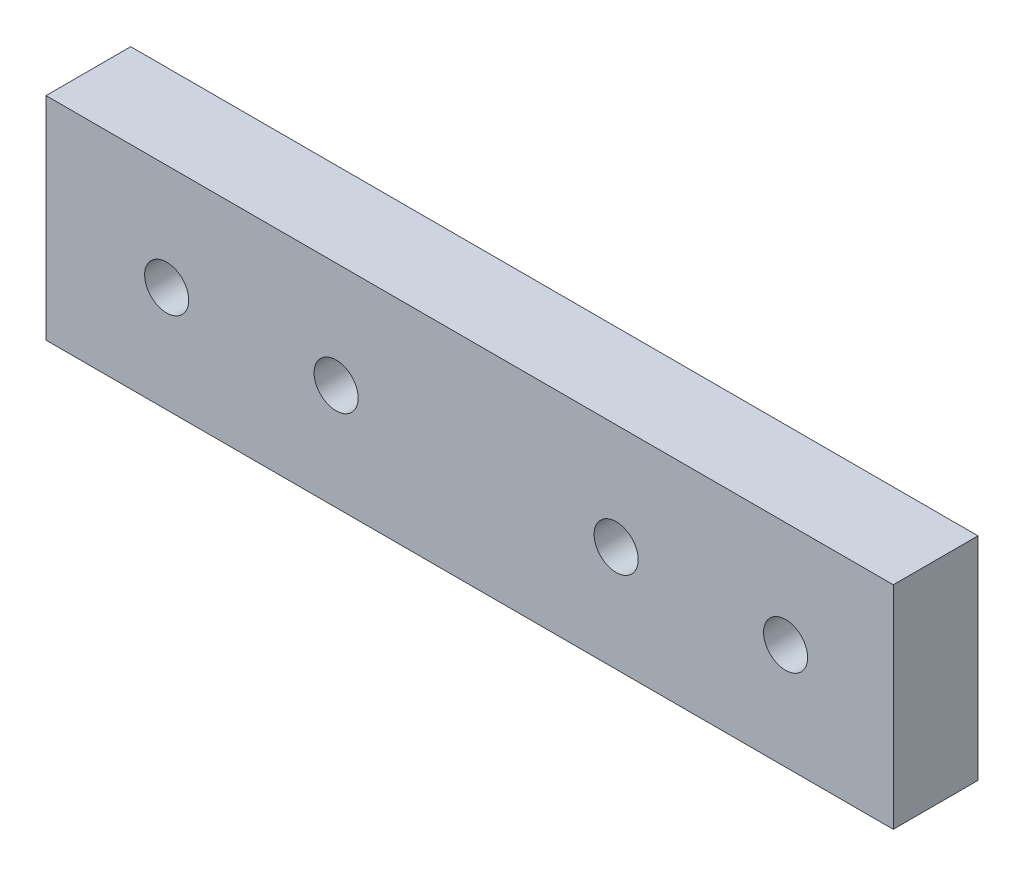
ISO-10303-21;
HEADER;
FILE_DESCRIPTION(('STEP AP214'),'2;1');
FILE_NAME('part.step','',(''),(''),'','','');
FILE_SCHEMA(('AUTOMOTIVE_DESIGN { 1 0 10303 214 1 1 1 1 }'));
ENDSEC;
DATA;
#1=APPLICATION_CONTEXT('core data for automotive mechanical design processes');
#2=APPLICATION_PROTOCOL_DEFINITION('international standard','automotive_design',2000,#1);
#3=PRODUCT_CONTEXT('',#1,'mechanical');
#4=PRODUCT('Part','Part','',(#3));
#5=PRODUCT_RELATED_PRODUCT_CATEGORY('part','',(#4));
#6=PRODUCT_DEFINITION_FORMATION('','',#4);
#7=PRODUCT_DEFINITION_CONTEXT('part definition',#1,'design');
#8=PRODUCT_DEFINITION('design','',#6,#7);
#9=PRODUCT_DEFINITION_SHAPE('','',#8);
#10=(LENGTH_UNIT() NAMED_UNIT(*) SI_UNIT(.MILLI.,.METRE.));
#11=(NAMED_UNIT(*) PLANE_ANGLE_UNIT() SI_UNIT($,.RADIAN.));
#12=(NAMED_UNIT(*) SI_UNIT($,.STERADIAN.) SOLID_ANGLE_UNIT());
#13=UNCERTAINTY_MEASURE_WITH_UNIT(LENGTH_MEASURE(1.E-05),#10,'distance_accuracy_value','');
#14=(GEOMETRIC_REPRESENTATION_CONTEXT(3) GLOBAL_UNCERTAINTY_ASSIGNED_CONTEXT((#13)) GLOBAL_UNIT_ASSIGNED_CONTEXT((#10,
#11,#12)) REPRESENTATION_CONTEXT('',''));
#15=CARTESIAN_POINT('',(0.,0.,0.));
#16=DIRECTION('',(0.,0.,1.));
#17=DIRECTION('',(1.,0.,0.));
#18=AXIS2_PLACEMENT_3D('',#15,#16,#17);
#19=CARTESIAN_POINT('',(116.291637204089,12.5,-75.));
#20=DIRECTION('',(0.,0.,1.));
#21=DIRECTION('',(1.,0.,0.));
#22=AXIS2_PLACEMENT_3D('',#19,#20,#21);
#23=CYLINDRICAL_SURFACE('',#22,2.6);
#24=CARTESIAN_POINT('',(116.291637204089,12.5,-17.5000000000001));
#25=DIRECTION('',(0.,0.,-1.));
#26=DIRECTION('',(-1.,0.,0.));
#27=AXIS2_PLACEMENT_3D('',#24,#25,#26);
#28=CIRCLE('',#27,2.6);
#29=CARTESIAN_POINT('',(113.691637204089,12.5,-17.5000000000001));
#30=VERTEX_POINT('',#29);
#31=EDGE_CURVE('E444',#30,#30,#28,.T.);
#32=ORIENTED_EDGE('',*,*,#31,.F.);
#33=EDGE_LOOP('',(#32));
#34=FACE_BOUND('',#33,.T.);
#35=CARTESIAN_POINT('',(116.291637204089,12.5,-24.5000000000001));
#36=DIRECTION('',(0.,0.,-1.));
#37=DIRECTION('',(0.,1.,0.));
#38=AXIS2_PLACEMENT_3D('',#35,#36,#37);
#39=CIRCLE('',#38,2.6);
#40=CARTESIAN_POINT('',(116.291637204089,15.1,-24.5000000000001));
#41=VERTEX_POINT('',#40);
#42=EDGE_CURVE('E36',#41,#41,#39,.F.);
#43=ORIENTED_EDGE('',*,*,#42,.F.);
#44=EDGE_LOOP('',(#43));
#45=FACE_BOUND('',#44,.T.);
#46=ADVANCED_FACE('F32',(#34,#45),#23,.F.);
#47=CARTESIAN_POINT('',(43.2405642550662,12.5,-75.));
#48=DIRECTION('',(0.,0.,1.));
#49=DIRECTION('',(1.,0.,0.));
#50=AXIS2_PLACEMENT_3D('',#47,#48,#49);
#51=CYLINDRICAL_SURFACE('',#50,2.6);
#52=CARTESIAN_POINT('',(43.2405642550662,12.5,-17.5000000000001));
#53=DIRECTION('',(0.,0.,-1.));
#54=DIRECTION('',(-1.,0.,0.));
#55=AXIS2_PLACEMENT_3D('',#52,#53,#54);
#56=CIRCLE('',#55,2.6);
#57=CARTESIAN_POINT('',(40.6405642550662,12.5,-17.5000000000001));
#58=VERTEX_POINT('',#57);
#59=EDGE_CURVE('E447',#58,#58,#56,.T.);
#60=ORIENTED_EDGE('',*,*,#59,.F.);
#61=EDGE_LOOP('',(#60));
#62=FACE_BOUND('',#61,.T.);
#63=CARTESIAN_POINT('',(43.2405642550662,12.5,-24.5000000000001));
#64=DIRECTION('',(0.,0.,-1.));
#65=DIRECTION('',(-1.,0.,0.));
#66=AXIS2_PLACEMENT_3D('',#63,#64,#65);
#67=CIRCLE('',#66,2.6);
#68=CARTESIAN_POINT('',(40.6405642550662,12.5,-24.5000000000001));
#69=VERTEX_POINT('',#68);
#70=EDGE_CURVE('E459',#69,#69,#67,.F.);
#71=ORIENTED_EDGE('',*,*,#70,.F.);
#72=EDGE_LOOP('',(#71));
#73=FACE_BOUND('',#72,.T.);
#74=ADVANCED_FACE('F469',(#62,#73),#51,.F.);
#75=CARTESIAN_POINT('',(96.2916372040886,12.5,-75.));
#76=DIRECTION('',(0.,0.,1.));
#77=DIRECTION('',(1.,0.,0.));
#78=AXIS2_PLACEMENT_3D('',#75,#76,#77);
#79=CYLINDRICAL_SURFACE('',#78,2.6);
#80=CARTESIAN_POINT('',(96.2916372040886,12.5,-17.5000000000001));
#81=DIRECTION('',(0.,0.,-1.));
#82=DIRECTION('',(-1.,0.,0.));
#83=AXIS2_PLACEMENT_3D('',#80,#81,#82);
#84=CIRCLE('',#83,2.6);
#85=CARTESIAN_POINT('',(93.6916372040886,12.5,-17.5000000000001));
#86=VERTEX_POINT('',#85);
#87=EDGE_CURVE('E450',#86,#86,#84,.T.);
#88=ORIENTED_EDGE('',*,*,#87,.F.);
#89=EDGE_LOOP('',(#88));
#90=FACE_BOUND('',#89,.T.);
#91=CARTESIAN_POINT('',(96.2916372040886,12.5,-24.5000000000001));
#92=DIRECTION('',(0.,0.,-1.));
#93=DIRECTION('',(-1.,0.,0.));
#94=AXIS2_PLACEMENT_3D('',#91,#92,#93);
#95=CIRCLE('',#94,2.6);
#96=CARTESIAN_POINT('',(93.6916372040886,12.5,-24.5000000000001));
#97=VERTEX_POINT('',#96);
#98=EDGE_CURVE('E457',#97,#97,#95,.F.);
#99=ORIENTED_EDGE('',*,*,#98,.F.);
#100=EDGE_LOOP('',(#99));
#101=FACE_BOUND('',#100,.T.);
#102=ADVANCED_FACE('F475',(#90,#101),#79,.F.);
#103=CARTESIAN_POINT('',(63.2405642550662,12.5,-75.));
#104=DIRECTION('',(0.,0.,1.));
#105=DIRECTION('',(1.,0.,0.));
#106=AXIS2_PLACEMENT_3D('',#103,#104,#105);
#107=CYLINDRICAL_SURFACE('',#106,2.6);
#108=CARTESIAN_POINT('',(63.2405642550662,12.5,-17.5000000000001));
#109=DIRECTION('',(0.,0.,-1.));
#110=DIRECTION('',(-1.,0.,0.));
#111=AXIS2_PLACEMENT_3D('',#108,#109,#110);
#112=CIRCLE('',#111,2.6);
#113=CARTESIAN_POINT('',(60.6405642550662,12.5,-17.5000000000001));
#114=VERTEX_POINT('',#113);
#115=EDGE_CURVE('E432',#114,#114,#112,.T.);
#116=ORIENTED_EDGE('',*,*,#115,.F.);
#117=EDGE_LOOP('',(#116));
#118=FACE_BOUND('',#117,.T.);
#119=CARTESIAN_POINT('',(63.2405642550662,12.5,-24.5000000000001));
#120=DIRECTION('',(0.,0.,-1.));
#121=DIRECTION('',(-1.,0.,0.));
#122=AXIS2_PLACEMENT_3D('',#119,#120,#121);
#123=CIRCLE('',#122,2.6);
#124=CARTESIAN_POINT('',(60.6405642550662,12.5,-24.5000000000001));
#125=VERTEX_POINT('',#124);
#126=EDGE_CURVE('E268',#125,#125,#123,.F.);
#127=ORIENTED_EDGE('',*,*,#126,.F.);
#128=EDGE_LOOP('',(#127));
#129=FACE_BOUND('',#128,.T.);
#130=ADVANCED_FACE('F502',(#118,#129),#107,.F.);
#131=CARTESIAN_POINT('',(29.0000000000001,25.,-27.5000000000001));
#132=DIRECTION('',(1.,0.,0.));
#133=DIRECTION('',(0.,0.,-1.));
#134=AXIS2_PLACEMENT_3D('',#131,#132,#133);
#135=PLANE('',#134);
#136=DIRECTION('',(0.,1.,0.));
#137=VECTOR('',#136,1.);
#138=CARTESIAN_POINT('',(29.0000000000001,25.,-17.5000000000001));
#139=LINE('',#138,#137);
#140=CARTESIAN_POINT('',(29.0000000000001,0.,-17.5000000000001));
#141=VERTEX_POINT('',#140);
#142=CARTESIAN_POINT('',(29.0000000000001,25.,-17.5000000000001));
#143=VERTEX_POINT('',#142);
#144=EDGE_CURVE('E428',#141,#143,#139,.T.);
#145=ORIENTED_EDGE('',*,*,#144,.T.);
#146=DIRECTION('',(0.,0.,1.));
#147=VECTOR('',#146,1.);
#148=CARTESIAN_POINT('',(29.0000000000001,25.,-27.5000000000001));
#149=LINE('',#148,#147);
#150=CARTESIAN_POINT('',(29.0000000000001,25.,-27.5000000000001));
#151=VERTEX_POINT('',#150);
#152=EDGE_CURVE('E11',#151,#143,#149,.T.);
#153=ORIENTED_EDGE('',*,*,#152,.F.);
#154=DIRECTION('',(0.,1.,0.));
#155=VECTOR('',#154,1.);
#156=CARTESIAN_POINT('',(29.0000000000001,25.,-27.5000000000001));
#157=LINE('',#156,#155);
#158=CARTESIAN_POINT('',(29.0000000000001,0.,-27.5000000000001));
#159=VERTEX_POINT('',#158);
#160=EDGE_CURVE('E417',#159,#151,#157,.T.);
#161=ORIENTED_EDGE('',*,*,#160,.F.);
#162=DIRECTION('',(0.,0.,1.));
#163=VECTOR('',#162,1.);
#164=CARTESIAN_POINT('',(29.0000000000001,0.,-27.5000000000001));
#165=LINE('',#164,#163);
#166=EDGE_CURVE('E427',#159,#141,#165,.T.);
#167=ORIENTED_EDGE('',*,*,#166,.T.);
#168=EDGE_LOOP('',(#145,#153,#161,#167));
#169=FACE_BOUND('',#168,.T.);
#170=ADVANCED_FACE('F34',(#169),#135,.F.);
#171=CARTESIAN_POINT('',(129.,25.,-27.5000000000001));
#172=DIRECTION('',(0.,-1.,0.));
#173=DIRECTION('',(0.,0.,-1.));
#174=AXIS2_PLACEMENT_3D('',#171,#172,#173);
#175=PLANE('',#174);
#176=DIRECTION('',(1.,0.,0.));
#177=VECTOR('',#176,1.);
#178=CARTESIAN_POINT('',(129.,25.,-17.5000000000001));
#179=LINE('',#178,#177);
#180=CARTESIAN_POINT('',(129.,25.,-17.5000000000001));
#181=VERTEX_POINT('',#180);
#182=EDGE_CURVE('E431',#143,#181,#179,.T.);
#183=ORIENTED_EDGE('',*,*,#182,.T.);
#184=DIRECTION('',(0.,0.,1.));
#185=VECTOR('',#184,1.);
#186=CARTESIAN_POINT('',(129.,25.,-27.5000000000001));
#187=LINE('',#186,#185);
#188=CARTESIAN_POINT('',(129.,25.,-27.5000000000001));
#189=VERTEX_POINT('',#188);
#190=EDGE_CURVE('E41',#189,#181,#187,.T.);
#191=ORIENTED_EDGE('',*,*,#190,.F.);
#192=DIRECTION('',(1.,0.,0.));
#193=VECTOR('',#192,1.);
#194=CARTESIAN_POINT('',(129.,25.,-27.5000000000001));
#195=LINE('',#194,#193);
#196=EDGE_CURVE('E420',#151,#189,#195,.T.);
#197=ORIENTED_EDGE('',*,*,#196,.F.);
#198=ORIENTED_EDGE('',*,*,#152,.T.);
#199=EDGE_LOOP('',(#183,#191,#197,#198));
#200=FACE_BOUND('',#199,.T.);
#201=ADVANCED_FACE('F495',(#200),#175,.F.);
#202=CARTESIAN_POINT('',(129.,25.,-27.5000000000001));
#203=DIRECTION('',(-1.,0.,0.));
#204=DIRECTION('',(0.,-1.,0.));
#205=AXIS2_PLACEMENT_3D('',#202,#203,#204);
#206=PLANE('',#205);
#207=DIRECTION('',(0.,-1.,0.));
#208=VECTOR('',#207,1.);
#209=CARTESIAN_POINT('',(129.,25.,-17.5000000000001));
#210=LINE('',#209,#208);
#211=CARTESIAN_POINT('',(129.,0.,-17.5000000000001));
#212=VERTEX_POINT('',#211);
#213=EDGE_CURVE('E434',#181,#212,#210,.T.);
#214=ORIENTED_EDGE('',*,*,#213,.T.);
#215=DIRECTION('',(0.,0.,1.));
#216=VECTOR('',#215,1.);
#217=CARTESIAN_POINT('',(129.,0.,-27.5000000000001));
#218=LINE('',#217,#216);
#219=CARTESIAN_POINT('',(129.,0.,-27.5000000000001));
#220=VERTEX_POINT('',#219);
#221=EDGE_CURVE('E439',#220,#212,#218,.T.);
#222=ORIENTED_EDGE('',*,*,#221,.F.);
#223=DIRECTION('',(0.,-1.,0.));
#224=VECTOR('',#223,1.);
#225=CARTESIAN_POINT('',(129.,25.,-27.5000000000001));
#226=LINE('',#225,#224);
#227=EDGE_CURVE('E423',#189,#220,#226,.T.);
#228=ORIENTED_EDGE('',*,*,#227,.F.);
#229=ORIENTED_EDGE('',*,*,#190,.T.);
#230=EDGE_LOOP('',(#214,#222,#228,#229));
#231=FACE_BOUND('',#230,.T.);
#232=ADVANCED_FACE('F492',(#231),#206,.F.);
#233=CARTESIAN_POINT('',(129.,0.,-27.5000000000001));
#234=DIRECTION('',(0.,1.,0.));
#235=DIRECTION('',(-1.,0.,0.));
#236=AXIS2_PLACEMENT_3D('',#233,#234,#235);
#237=PLANE('',#236);
#238=DIRECTION('',(-1.,0.,0.));
#239=VECTOR('',#238,1.);
#240=CARTESIAN_POINT('',(129.,0.,-17.5000000000001));
#241=LINE('',#240,#239);
#242=EDGE_CURVE('E421',#212,#141,#241,.T.);
#243=ORIENTED_EDGE('',*,*,#242,.T.);
#244=ORIENTED_EDGE('',*,*,#166,.F.);
#245=DIRECTION('',(-1.,0.,0.));
#246=VECTOR('',#245,1.);
#247=CARTESIAN_POINT('',(129.,0.,-27.5000000000001));
#248=LINE('',#247,#246);
#249=EDGE_CURVE('E425',#220,#159,#248,.T.);
#250=ORIENTED_EDGE('',*,*,#249,.F.);
#251=ORIENTED_EDGE('',*,*,#221,.T.);
#252=EDGE_LOOP('',(#243,#244,#250,#251));
#253=FACE_BOUND('',#252,.T.);
#254=ADVANCED_FACE('F485',(#253),#237,.F.);
#255=CARTESIAN_POINT('',(0.,0.,-27.5000000000001));
#256=DIRECTION('',(0.,0.,-1.));
#257=DIRECTION('',(-1.,0.,0.));
#258=AXIS2_PLACEMENT_3D('',#255,#256,#257);
#259=PLANE('',#258);
#260=DIRECTION('',(-1.,0.,0.));
#261=VECTOR('',#260,1.);
#262=CARTESIAN_POINT('',(65.6077003587437,8.40000000000001,-27.5000000000001));
#263=LINE('',#262,#261);
#264=CARTESIAN_POINT('',(65.6077003587437,8.40000000000001,-27.5000000000001));
#265=VERTEX_POINT('',#264);
#266=CARTESIAN_POINT('',(60.8734281513888,8.40000000000001,-27.5000000000001));
#267=VERTEX_POINT('',#266);
#268=EDGE_CURVE('E49',#265,#267,#263,.T.);
#269=ORIENTED_EDGE('',*,*,#268,.F.);
#270=DIRECTION('',(-0.499999999999999,-0.866025403784439,0.));
#271=VECTOR('',#270,1.);
#272=CARTESIAN_POINT('',(67.9748364624211,12.5,-27.5000000000001));
#273=LINE('',#272,#271);
#274=CARTESIAN_POINT('',(67.9748364624211,12.5,-27.5000000000001));
#275=VERTEX_POINT('',#274);
#276=EDGE_CURVE('E241',#275,#265,#273,.T.);
#277=ORIENTED_EDGE('',*,*,#276,.F.);
#278=DIRECTION('',(0.5,-0.866025403784439,0.));
#279=VECTOR('',#278,1.);
#280=CARTESIAN_POINT('',(65.6077003587437,16.6,-27.5000000000001));
#281=LINE('',#280,#279);
#282=CARTESIAN_POINT('',(65.6077003587437,16.6,-27.5000000000001));
#283=VERTEX_POINT('',#282);
#284=EDGE_CURVE('E244',#283,#275,#281,.T.);
#285=ORIENTED_EDGE('',*,*,#284,.F.);
#286=DIRECTION('',(1.,0.,0.));
#287=VECTOR('',#286,1.);
#288=CARTESIAN_POINT('',(60.8734281513888,16.6,-27.5000000000001));
#289=LINE('',#288,#287);
#290=CARTESIAN_POINT('',(60.8734281513888,16.6,-27.5000000000001));
#291=VERTEX_POINT('',#290);
#292=EDGE_CURVE('E261',#291,#283,#289,.T.);
#293=ORIENTED_EDGE('',*,*,#292,.F.);
#294=DIRECTION('',(0.5,0.866025403784438,0.));
#295=VECTOR('',#294,1.);
#296=CARTESIAN_POINT('',(58.5062920477113,12.5,-27.5000000000001));
#297=LINE('',#296,#295);
#298=CARTESIAN_POINT('',(58.5062920477113,12.5,-27.5000000000001));
#299=VERTEX_POINT('',#298);
#300=EDGE_CURVE('E258',#299,#291,#297,.T.);
#301=ORIENTED_EDGE('',*,*,#300,.F.);
#302=DIRECTION('',(-0.5,0.866025403784439,0.));
#303=VECTOR('',#302,1.);
#304=CARTESIAN_POINT('',(60.8734281513888,8.40000000000001,-27.5000000000001));
#305=LINE('',#304,#303);
#306=EDGE_CURVE('E255',#267,#299,#305,.T.);
#307=ORIENTED_EDGE('',*,*,#306,.F.);
#308=EDGE_LOOP('',(#269,#277,#285,#293,#301,#307));
#309=FACE_BOUND('',#308,.T.);
#310=DIRECTION('',(-1.,0.,0.));
#311=VECTOR('',#310,1.);
#312=CARTESIAN_POINT('',(98.658773307766,8.40000000000001,-27.5000000000001));
#313=LINE('',#312,#311);
#314=CARTESIAN_POINT('',(98.658773307766,8.40000000000001,-27.5000000000001));
#315=VERTEX_POINT('',#314);
#316=CARTESIAN_POINT('',(93.9245011004111,8.40000000000002,-27.5000000000001));
#317=VERTEX_POINT('',#316);
#318=EDGE_CURVE('E57',#315,#317,#313,.T.);
#319=ORIENTED_EDGE('',*,*,#318,.F.);
#320=DIRECTION('',(-0.5,-0.866025403784438,0.));
#321=VECTOR('',#320,1.);
#322=CARTESIAN_POINT('',(101.025909411443,12.5,-27.5000000000001));
#323=LINE('',#322,#321);
#324=CARTESIAN_POINT('',(101.025909411443,12.5,-27.5000000000001));
#325=VERTEX_POINT('',#324);
#326=EDGE_CURVE('E280',#325,#315,#323,.T.);
#327=ORIENTED_EDGE('',*,*,#326,.F.);
#328=DIRECTION('',(0.500000000000001,-0.866025403784438,0.));
#329=VECTOR('',#328,1.);
#330=CARTESIAN_POINT('',(98.658773307766,16.6,-27.5000000000001));
#331=LINE('',#330,#329);
#332=CARTESIAN_POINT('',(98.658773307766,16.6,-27.5000000000001));
#333=VERTEX_POINT('',#332);
#334=EDGE_CURVE('E307',#333,#325,#331,.T.);
#335=ORIENTED_EDGE('',*,*,#334,.F.);
#336=DIRECTION('',(1.,0.,0.));
#337=VECTOR('',#336,1.);
#338=CARTESIAN_POINT('',(93.9245011004111,16.6,-27.5000000000001));
#339=LINE('',#338,#337);
#340=CARTESIAN_POINT('',(93.9245011004111,16.6,-27.5000000000001));
#341=VERTEX_POINT('',#340);
#342=EDGE_CURVE('E304',#341,#333,#339,.T.);
#343=ORIENTED_EDGE('',*,*,#342,.F.);
#344=DIRECTION('',(0.5,0.866025403784439,0.));
#345=VECTOR('',#344,1.);
#346=CARTESIAN_POINT('',(91.5573649967337,12.5,-27.5000000000001));
#347=LINE('',#346,#345);
#348=CARTESIAN_POINT('',(91.5573649967337,12.5,-27.5000000000001));
#349=VERTEX_POINT('',#348);
#350=EDGE_CURVE('E301',#349,#341,#347,.T.);
#351=ORIENTED_EDGE('',*,*,#350,.F.);
#352=DIRECTION('',(-0.499999999999999,0.866025403784439,0.));
#353=VECTOR('',#352,1.);
#354=CARTESIAN_POINT('',(93.9245011004111,8.40000000000002,-27.5000000000001));
#355=LINE('',#354,#353);
#356=EDGE_CURVE('E297',#317,#349,#355,.T.);
#357=ORIENTED_EDGE('',*,*,#356,.F.);
#358=EDGE_LOOP('',(#319,#327,#335,#343,#351,#357));
#359=FACE_BOUND('',#358,.T.);
#360=DIRECTION('',(-1.,0.,0.));
#361=VECTOR('',#360,1.);
#362=CARTESIAN_POINT('',(45.6077003587437,8.39999999999999,-27.5000000000001));
#363=LINE('',#362,#361);
#364=CARTESIAN_POINT('',(45.6077003587437,8.39999999999999,-27.5000000000001));
#365=VERTEX_POINT('',#364);
#366=CARTESIAN_POINT('',(40.8734281513887,8.39999999999998,-27.5000000000001));
#367=VERTEX_POINT('',#366);
#368=EDGE_CURVE('E342',#365,#367,#363,.T.);
#369=ORIENTED_EDGE('',*,*,#368,.F.);
#370=DIRECTION('',(-0.500000000000001,-0.866025403784438,0.));
#371=VECTOR('',#370,1.);
#372=CARTESIAN_POINT('',(47.9748364624212,12.5,-27.5000000000001));
#373=LINE('',#372,#371);
#374=CARTESIAN_POINT('',(47.9748364624212,12.5,-27.5000000000001));
#375=VERTEX_POINT('',#374);
#376=EDGE_CURVE('E326',#375,#365,#373,.T.);
#377=ORIENTED_EDGE('',*,*,#376,.F.);
#378=DIRECTION('',(0.5,-0.866025403784439,0.));
#379=VECTOR('',#378,1.);
#380=CARTESIAN_POINT('',(45.6077003587437,16.6,-27.5000000000001));
#381=LINE('',#380,#379);
#382=CARTESIAN_POINT('',(45.6077003587437,16.6,-27.5000000000001));
#383=VERTEX_POINT('',#382);
#384=EDGE_CURVE('E354',#383,#375,#381,.T.);
#385=ORIENTED_EDGE('',*,*,#384,.F.);
#386=DIRECTION('',(1.,0.,0.));
#387=VECTOR('',#386,1.);
#388=CARTESIAN_POINT('',(40.8734281513888,16.6,-27.5000000000001));
#389=LINE('',#388,#387);
#390=CARTESIAN_POINT('',(40.8734281513888,16.6,-27.5000000000001));
#391=VERTEX_POINT('',#390);
#392=EDGE_CURVE('E351',#391,#383,#389,.T.);
#393=ORIENTED_EDGE('',*,*,#392,.F.);
#394=DIRECTION('',(0.500000000000001,0.866025403784438,0.));
#395=VECTOR('',#394,1.);
#396=CARTESIAN_POINT('',(38.5062920477113,12.5,-27.5000000000001));
#397=LINE('',#396,#395);
#398=CARTESIAN_POINT('',(38.5062920477113,12.5,-27.5000000000001));
#399=VERTEX_POINT('',#398);
#400=EDGE_CURVE('E348',#399,#391,#397,.T.);
#401=ORIENTED_EDGE('',*,*,#400,.F.);
#402=DIRECTION('',(-0.499999999999997,0.86602540378444,0.));
#403=VECTOR('',#402,1.);
#404=CARTESIAN_POINT('',(40.8734281513887,8.39999999999998,-27.5000000000001));
#405=LINE('',#404,#403);
#406=EDGE_CURVE('E344',#367,#399,#405,.T.);
#407=ORIENTED_EDGE('',*,*,#406,.F.);
#408=EDGE_LOOP('',(#369,#377,#385,#393,#401,#407));
#409=FACE_BOUND('',#408,.T.);
#410=DIRECTION('',(-1.,0.,0.));
#411=VECTOR('',#410,1.);
#412=CARTESIAN_POINT('',(118.658773307766,8.39999999999999,-27.5000000000001));
#413=LINE('',#412,#411);
#414=CARTESIAN_POINT('',(118.658773307766,8.39999999999999,-27.5000000000001));
#415=VERTEX_POINT('',#414);
#416=CARTESIAN_POINT('',(113.924501100411,8.39999999999999,-27.5000000000001));
#417=VERTEX_POINT('',#416);
#418=EDGE_CURVE('E390',#415,#417,#413,.T.);
#419=ORIENTED_EDGE('',*,*,#418,.F.);
#420=DIRECTION('',(-0.500000000000006,-0.866025403784435,0.));
#421=VECTOR('',#420,1.);
#422=CARTESIAN_POINT('',(121.025909411444,12.5,-27.5000000000001));
#423=LINE('',#422,#421);
#424=CARTESIAN_POINT('',(121.025909411444,12.5,-27.5000000000001));
#425=VERTEX_POINT('',#424);
#426=EDGE_CURVE('E374',#425,#415,#423,.T.);
#427=ORIENTED_EDGE('',*,*,#426,.F.);
#428=DIRECTION('',(0.5,-0.866025403784439,0.));
#429=VECTOR('',#428,1.);
#430=CARTESIAN_POINT('',(118.658773307766,16.6,-27.5000000000001));
#431=LINE('',#430,#429);
#432=CARTESIAN_POINT('',(118.658773307766,16.6,-27.5000000000001));
#433=VERTEX_POINT('',#432);
#434=EDGE_CURVE('E401',#433,#425,#431,.T.);
#435=ORIENTED_EDGE('',*,*,#434,.F.);
#436=DIRECTION('',(1.,0.,0.));
#437=VECTOR('',#436,1.);
#438=CARTESIAN_POINT('',(113.924501100411,16.6,-27.5000000000001));
#439=LINE('',#438,#437);
#440=CARTESIAN_POINT('',(113.924501100411,16.6,-27.5000000000001));
#441=VERTEX_POINT('',#440);
#442=EDGE_CURVE('E398',#441,#433,#439,.T.);
#443=ORIENTED_EDGE('',*,*,#442,.F.);
#444=DIRECTION('',(0.500000000000005,0.866025403784436,0.));
#445=VECTOR('',#444,1.);
#446=CARTESIAN_POINT('',(111.557364996734,12.5,-27.5000000000001));
#447=LINE('',#446,#445);
#448=CARTESIAN_POINT('',(111.557364996734,12.5,-27.5000000000001));
#449=VERTEX_POINT('',#448);
#450=EDGE_CURVE('E395',#449,#441,#447,.T.);
#451=ORIENTED_EDGE('',*,*,#450,.F.);
#452=DIRECTION('',(-0.500000000000003,0.866025403784437,0.));
#453=VECTOR('',#452,1.);
#454=CARTESIAN_POINT('',(113.924501100411,8.39999999999999,-27.5000000000001));
#455=LINE('',#454,#453);
#456=EDGE_CURVE('E392',#417,#449,#455,.T.);
#457=ORIENTED_EDGE('',*,*,#456,.F.);
#458=EDGE_LOOP('',(#419,#427,#435,#443,#451,#457));
#459=FACE_BOUND('',#458,.T.);
#460=ORIENTED_EDGE('',*,*,#160,.T.);
#461=ORIENTED_EDGE('',*,*,#196,.T.);
#462=ORIENTED_EDGE('',*,*,#227,.T.);
#463=ORIENTED_EDGE('',*,*,#249,.T.);
#464=EDGE_LOOP('',(#460,#461,#462,#463));
#465=FACE_BOUND('',#464,.T.);
#466=ADVANCED_FACE('F481',(#309,#359,#409,#459,#465),#259,.T.);
#467=CARTESIAN_POINT('',(0.,0.,-17.5));
#468=DIRECTION('',(0.,0.,-1.));
#469=DIRECTION('',(-1.,0.,0.));
#470=AXIS2_PLACEMENT_3D('',#467,#468,#469);
#471=PLANE('',#470);
#472=ORIENTED_EDGE('',*,*,#115,.T.);
#473=EDGE_LOOP('',(#472));
#474=FACE_BOUND('',#473,.T.);
#475=ORIENTED_EDGE('',*,*,#87,.T.);
#476=EDGE_LOOP('',(#475));
#477=FACE_BOUND('',#476,.T.);
#478=ORIENTED_EDGE('',*,*,#59,.T.);
#479=EDGE_LOOP('',(#478));
#480=FACE_BOUND('',#479,.T.);
#481=ORIENTED_EDGE('',*,*,#31,.T.);
#482=EDGE_LOOP('',(#481));
#483=FACE_BOUND('',#482,.T.);
#484=ORIENTED_EDGE('',*,*,#144,.F.);
#485=ORIENTED_EDGE('',*,*,#242,.F.);
#486=ORIENTED_EDGE('',*,*,#213,.F.);
#487=ORIENTED_EDGE('',*,*,#182,.F.);
#488=EDGE_LOOP('',(#484,#485,#486,#487));
#489=FACE_BOUND('',#488,.T.);
#490=ADVANCED_FACE('F484',(#474,#477,#480,#483,#489),#471,.F.);
#491=CARTESIAN_POINT('',(0.,0.,-24.5));
#492=DIRECTION('',(0.,0.,-1.));
#493=DIRECTION('',(-1.,0.,0.));
#494=AXIS2_PLACEMENT_3D('',#491,#492,#493);
#495=PLANE('',#494);
#496=DIRECTION('',(-1.,0.,0.));
#497=VECTOR('',#496,1.);
#498=CARTESIAN_POINT('',(65.6077003587437,8.40000000000001,-24.5000000000001));
#499=LINE('',#498,#497);
#500=CARTESIAN_POINT('',(65.6077003587437,8.40000000000001,-24.5000000000001));
#501=VERTEX_POINT('',#500);
#502=CARTESIAN_POINT('',(60.8734281513888,8.40000000000001,-24.5000000000001));
#503=VERTEX_POINT('',#502);
#504=EDGE_CURVE('E221',#501,#503,#499,.T.);
#505=ORIENTED_EDGE('',*,*,#504,.T.);
#506=DIRECTION('',(-0.5,0.866025403784439,0.));
#507=VECTOR('',#506,1.);
#508=CARTESIAN_POINT('',(60.8734281513888,8.40000000000001,-24.5000000000001));
#509=LINE('',#508,#507);
#510=CARTESIAN_POINT('',(58.5062920477113,12.5,-24.5000000000001));
#511=VERTEX_POINT('',#510);
#512=EDGE_CURVE('E230',#503,#511,#509,.T.);
#513=ORIENTED_EDGE('',*,*,#512,.T.);
#514=DIRECTION('',(0.5,0.866025403784438,0.));
#515=VECTOR('',#514,1.);
#516=CARTESIAN_POINT('',(58.5062920477113,12.5,-24.5000000000001));
#517=LINE('',#516,#515);
#518=CARTESIAN_POINT('',(60.8734281513888,16.6,-24.5000000000001));
#519=VERTEX_POINT('',#518);
#520=EDGE_CURVE('E235',#511,#519,#517,.T.);
#521=ORIENTED_EDGE('',*,*,#520,.T.);
#522=DIRECTION('',(1.,0.,0.));
#523=VECTOR('',#522,1.);
#524=CARTESIAN_POINT('',(60.8734281513888,16.6,-24.5000000000001));
#525=LINE('',#524,#523);
#526=CARTESIAN_POINT('',(65.6077003587437,16.6,-24.5000000000001));
#527=VERTEX_POINT('',#526);
#528=EDGE_CURVE('E248',#519,#527,#525,.T.);
#529=ORIENTED_EDGE('',*,*,#528,.T.);
#530=DIRECTION('',(0.5,-0.866025403784439,0.));
#531=VECTOR('',#530,1.);
#532=CARTESIAN_POINT('',(65.6077003587437,16.6,-24.5000000000001));
#533=LINE('',#532,#531);
#534=CARTESIAN_POINT('',(67.9748364624211,12.5,-24.5000000000001));
#535=VERTEX_POINT('',#534);
#536=EDGE_CURVE('E251',#527,#535,#533,.T.);
#537=ORIENTED_EDGE('',*,*,#536,.T.);
#538=DIRECTION('',(-0.499999999999999,-0.866025403784439,0.));
#539=VECTOR('',#538,1.);
#540=CARTESIAN_POINT('',(67.9748364624211,12.5,-24.5000000000001));
#541=LINE('',#540,#539);
#542=EDGE_CURVE('E227',#535,#501,#541,.T.);
#543=ORIENTED_EDGE('',*,*,#542,.T.);
#544=EDGE_LOOP('',(#505,#513,#521,#529,#537,#543));
#545=FACE_BOUND('',#544,.T.);
#546=ORIENTED_EDGE('',*,*,#126,.T.);
#547=EDGE_LOOP('',(#546));
#548=FACE_BOUND('',#547,.T.);
#549=ADVANCED_FACE('F237',(#545,#548),#495,.T.);
#550=CARTESIAN_POINT('',(65.6077003587437,8.40000000000001,-24.5000000000001));
#551=DIRECTION('',(0.,-1.,0.));
#552=DIRECTION('',(1.,0.,0.));
#553=AXIS2_PLACEMENT_3D('',#550,#551,#552);
#554=PLANE('',#553);
#555=ORIENTED_EDGE('',*,*,#268,.T.);
#556=DIRECTION('',(0.,0.,-1.));
#557=VECTOR('',#556,1.);
#558=CARTESIAN_POINT('',(60.8734281513888,8.40000000000001,-24.5000000000001));
#559=LINE('',#558,#557);
#560=EDGE_CURVE('E217',#503,#267,#559,.T.);
#561=ORIENTED_EDGE('',*,*,#560,.F.);
#562=ORIENTED_EDGE('',*,*,#504,.F.);
#563=DIRECTION('',(0.,0.,-1.));
#564=VECTOR('',#563,1.);
#565=CARTESIAN_POINT('',(65.6077003587437,8.40000000000001,-24.5000000000001));
#566=LINE('',#565,#564);
#567=EDGE_CURVE('E266',#501,#265,#566,.T.);
#568=ORIENTED_EDGE('',*,*,#567,.T.);
#569=EDGE_LOOP('',(#555,#561,#562,#568));
#570=FACE_BOUND('',#569,.T.);
#571=ADVANCED_FACE('F219',(#570),#554,.F.);
#572=CARTESIAN_POINT('',(67.9748364624211,12.5,-24.5000000000001));
#573=DIRECTION('',(0.866025403784439,-0.499999999999999,0.));
#574=DIRECTION('',(0.499999999999999,0.866025403784439,0.));
#575=AXIS2_PLACEMENT_3D('',#572,#573,#574);
#576=PLANE('',#575);
#577=ORIENTED_EDGE('',*,*,#276,.T.);
#578=ORIENTED_EDGE('',*,*,#567,.F.);
#579=ORIENTED_EDGE('',*,*,#542,.F.);
#580=DIRECTION('',(0.,0.,-1.));
#581=VECTOR('',#580,1.);
#582=CARTESIAN_POINT('',(67.9748364624211,12.5,-24.5000000000001));
#583=LINE('',#582,#581);
#584=EDGE_CURVE('E269',#535,#275,#583,.T.);
#585=ORIENTED_EDGE('',*,*,#584,.T.);
#586=EDGE_LOOP('',(#577,#578,#579,#585));
#587=FACE_BOUND('',#586,.T.);
#588=ADVANCED_FACE('F612',(#587),#576,.F.);
#589=CARTESIAN_POINT('',(65.6077003587437,16.6,-24.5000000000001));
#590=DIRECTION('',(0.866025403784439,0.5,0.));
#591=DIRECTION('',(-0.5,0.866025403784439,0.));
#592=AXIS2_PLACEMENT_3D('',#589,#590,#591);
#593=PLANE('',#592);
#594=ORIENTED_EDGE('',*,*,#284,.T.);
#595=ORIENTED_EDGE('',*,*,#584,.F.);
#596=ORIENTED_EDGE('',*,*,#536,.F.);
#597=DIRECTION('',(0.,0.,-1.));
#598=VECTOR('',#597,1.);
#599=CARTESIAN_POINT('',(65.6077003587437,16.6,-24.5000000000001));
#600=LINE('',#599,#598);
#601=EDGE_CURVE('E271',#527,#283,#600,.T.);
#602=ORIENTED_EDGE('',*,*,#601,.T.);
#603=EDGE_LOOP('',(#594,#595,#596,#602));
#604=FACE_BOUND('',#603,.T.);
#605=ADVANCED_FACE('F622',(#604),#593,.F.);
#606=CARTESIAN_POINT('',(60.8734281513888,16.6,-24.5000000000001));
#607=DIRECTION('',(0.,1.,0.));
#608=DIRECTION('',(0.,0.,1.));
#609=AXIS2_PLACEMENT_3D('',#606,#607,#608);
#610=PLANE('',#609);
#611=ORIENTED_EDGE('',*,*,#292,.T.);
#612=ORIENTED_EDGE('',*,*,#601,.F.);
#613=ORIENTED_EDGE('',*,*,#528,.F.);
#614=DIRECTION('',(0.,0.,-1.));
#615=VECTOR('',#614,1.);
#616=CARTESIAN_POINT('',(60.8734281513888,16.6,-24.5000000000001));
#617=LINE('',#616,#615);
#618=EDGE_CURVE('E273',#519,#291,#617,.T.);
#619=ORIENTED_EDGE('',*,*,#618,.T.);
#620=EDGE_LOOP('',(#611,#612,#613,#619));
#621=FACE_BOUND('',#620,.T.);
#622=ADVANCED_FACE('F618',(#621),#610,.F.);
#623=CARTESIAN_POINT('',(58.5062920477113,12.5,-24.5000000000001));
#624=DIRECTION('',(-0.866025403784438,0.500000000000001,0.));
#625=DIRECTION('',(-0.500000000000001,-0.866025403784438,0.));
#626=AXIS2_PLACEMENT_3D('',#623,#624,#625);
#627=PLANE('',#626);
#628=ORIENTED_EDGE('',*,*,#300,.T.);
#629=ORIENTED_EDGE('',*,*,#618,.F.);
#630=ORIENTED_EDGE('',*,*,#520,.F.);
#631=DIRECTION('',(0.,0.,-1.));
#632=VECTOR('',#631,1.);
#633=CARTESIAN_POINT('',(58.5062920477113,12.5,-24.5000000000001));
#634=LINE('',#633,#632);
#635=EDGE_CURVE('E226',#511,#299,#634,.T.);
#636=ORIENTED_EDGE('',*,*,#635,.T.);
#637=EDGE_LOOP('',(#628,#629,#630,#636));
#638=FACE_BOUND('',#637,.T.);
#639=ADVANCED_FACE('F615',(#638),#627,.F.);
#640=CARTESIAN_POINT('',(60.8734281513888,8.40000000000001,-24.5000000000001));
#641=DIRECTION('',(-0.866025403784438,-0.5,0.));
#642=DIRECTION('',(0.5,-0.866025403784439,0.));
#643=AXIS2_PLACEMENT_3D('',#640,#641,#642);
#644=PLANE('',#643);
#645=ORIENTED_EDGE('',*,*,#306,.T.);
#646=ORIENTED_EDGE('',*,*,#635,.F.);
#647=ORIENTED_EDGE('',*,*,#512,.F.);
#648=ORIENTED_EDGE('',*,*,#560,.T.);
#649=EDGE_LOOP('',(#645,#646,#647,#648));
#650=FACE_BOUND('',#649,.T.);
#651=ADVANCED_FACE('F231',(#650),#644,.F.);
#652=CARTESIAN_POINT('',(0.,0.,-24.5));
#653=DIRECTION('',(0.,0.,-1.));
#654=DIRECTION('',(-1.,0.,0.));
#655=AXIS2_PLACEMENT_3D('',#652,#653,#654);
#656=PLANE('',#655);
#657=DIRECTION('',(-1.,0.,0.));
#658=VECTOR('',#657,1.);
#659=CARTESIAN_POINT('',(98.658773307766,8.40000000000001,-24.5000000000001));
#660=LINE('',#659,#658);
#661=CARTESIAN_POINT('',(98.658773307766,8.40000000000001,-24.5000000000001));
#662=VERTEX_POINT('',#661);
#663=CARTESIAN_POINT('',(93.9245011004111,8.40000000000002,-24.5000000000001));
#664=VERTEX_POINT('',#663);
#665=EDGE_CURVE('E276',#662,#664,#660,.T.);
#666=ORIENTED_EDGE('',*,*,#665,.T.);
#667=DIRECTION('',(-0.499999999999999,0.866025403784439,0.));
#668=VECTOR('',#667,1.);
#669=CARTESIAN_POINT('',(93.9245011004111,8.40000000000002,-24.5000000000001));
#670=LINE('',#669,#668);
#671=CARTESIAN_POINT('',(91.5573649967337,12.5,-24.5000000000001));
#672=VERTEX_POINT('',#671);
#673=EDGE_CURVE('E279',#664,#672,#670,.T.);
#674=ORIENTED_EDGE('',*,*,#673,.T.);
#675=DIRECTION('',(0.5,0.866025403784439,0.));
#676=VECTOR('',#675,1.);
#677=CARTESIAN_POINT('',(91.5573649967337,12.5,-24.5000000000001));
#678=LINE('',#677,#676);
#679=CARTESIAN_POINT('',(93.9245011004111,16.6,-24.5000000000001));
#680=VERTEX_POINT('',#679);
#681=EDGE_CURVE('E283',#672,#680,#678,.T.);
#682=ORIENTED_EDGE('',*,*,#681,.T.);
#683=DIRECTION('',(1.,0.,0.));
#684=VECTOR('',#683,1.);
#685=CARTESIAN_POINT('',(93.9245011004111,16.6,-24.5000000000001));
#686=LINE('',#685,#684);
#687=CARTESIAN_POINT('',(98.658773307766,16.6,-24.5000000000001));
#688=VERTEX_POINT('',#687);
#689=EDGE_CURVE('E286',#680,#688,#686,.T.);
#690=ORIENTED_EDGE('',*,*,#689,.T.);
#691=DIRECTION('',(0.500000000000001,-0.866025403784438,0.));
#692=VECTOR('',#691,1.);
#693=CARTESIAN_POINT('',(98.658773307766,16.6,-24.5000000000001));
#694=LINE('',#693,#692);
#695=CARTESIAN_POINT('',(101.025909411443,12.5,-24.5000000000001));
#696=VERTEX_POINT('',#695);
#697=EDGE_CURVE('E289',#688,#696,#694,.T.);
#698=ORIENTED_EDGE('',*,*,#697,.T.);
#699=DIRECTION('',(-0.5,-0.866025403784438,0.));
#700=VECTOR('',#699,1.);
#701=CARTESIAN_POINT('',(101.025909411443,12.5,-24.5000000000001));
#702=LINE('',#701,#700);
#703=EDGE_CURVE('E292',#696,#662,#702,.T.);
#704=ORIENTED_EDGE('',*,*,#703,.T.);
#705=EDGE_LOOP('',(#666,#674,#682,#690,#698,#704));
#706=FACE_BOUND('',#705,.T.);
#707=ORIENTED_EDGE('',*,*,#98,.T.);
#708=EDGE_LOOP('',(#707));
#709=FACE_BOUND('',#708,.T.);
#710=ADVANCED_FACE('F588',(#706,#709),#656,.T.);
#711=CARTESIAN_POINT('',(98.658773307766,8.40000000000001,-24.5000000000001));
#712=DIRECTION('',(0.,-1.,0.));
#713=DIRECTION('',(1.,0.,0.));
#714=AXIS2_PLACEMENT_3D('',#711,#712,#713);
#715=PLANE('',#714);
#716=ORIENTED_EDGE('',*,*,#318,.T.);
#717=DIRECTION('',(0.,0.,-1.));
#718=VECTOR('',#717,1.);
#719=CARTESIAN_POINT('',(93.9245011004111,8.40000000000002,-24.5000000000001));
#720=LINE('',#719,#718);
#721=EDGE_CURVE('E295',#664,#317,#720,.T.);
#722=ORIENTED_EDGE('',*,*,#721,.F.);
#723=ORIENTED_EDGE('',*,*,#665,.F.);
#724=DIRECTION('',(0.,0.,-1.));
#725=VECTOR('',#724,1.);
#726=CARTESIAN_POINT('',(98.658773307766,8.40000000000001,-24.5000000000001));
#727=LINE('',#726,#725);
#728=EDGE_CURVE('E256',#662,#315,#727,.T.);
#729=ORIENTED_EDGE('',*,*,#728,.T.);
#730=EDGE_LOOP('',(#716,#722,#723,#729));
#731=FACE_BOUND('',#730,.T.);
#732=ADVANCED_FACE('F584',(#731),#715,.F.);
#733=CARTESIAN_POINT('',(101.025909411443,12.5,-24.5000000000001));
#734=DIRECTION('',(0.866025403784438,-0.5,0.));
#735=DIRECTION('',(0.5,0.866025403784438,0.));
#736=AXIS2_PLACEMENT_3D('',#733,#734,#735);
#737=PLANE('',#736);
#738=ORIENTED_EDGE('',*,*,#326,.T.);
#739=ORIENTED_EDGE('',*,*,#728,.F.);
#740=ORIENTED_EDGE('',*,*,#703,.F.);
#741=DIRECTION('',(0.,0.,-1.));
#742=VECTOR('',#741,1.);
#743=CARTESIAN_POINT('',(101.025909411443,12.5,-24.5000000000001));
#744=LINE('',#743,#742);
#745=EDGE_CURVE('E313',#696,#325,#744,.T.);
#746=ORIENTED_EDGE('',*,*,#745,.T.);
#747=EDGE_LOOP('',(#738,#739,#740,#746));
#748=FACE_BOUND('',#747,.T.);
#749=ADVANCED_FACE('F587',(#748),#737,.F.);
#750=CARTESIAN_POINT('',(98.658773307766,16.6,-24.5000000000001));
#751=DIRECTION('',(0.866025403784438,0.500000000000001,0.));
#752=DIRECTION('',(-0.500000000000001,0.866025403784438,0.));
#753=AXIS2_PLACEMENT_3D('',#750,#751,#752);
#754=PLANE('',#753);
#755=ORIENTED_EDGE('',*,*,#334,.T.);
#756=ORIENTED_EDGE('',*,*,#745,.F.);
#757=ORIENTED_EDGE('',*,*,#697,.F.);
#758=DIRECTION('',(0.,0.,-1.));
#759=VECTOR('',#758,1.);
#760=CARTESIAN_POINT('',(98.658773307766,16.6,-24.5000000000001));
#761=LINE('',#760,#759);
#762=EDGE_CURVE('E315',#688,#333,#761,.T.);
#763=ORIENTED_EDGE('',*,*,#762,.T.);
#764=EDGE_LOOP('',(#755,#756,#757,#763));
#765=FACE_BOUND('',#764,.T.);
#766=ADVANCED_FACE('F599',(#765),#754,.F.);
#767=CARTESIAN_POINT('',(93.9245011004111,16.6,-24.5000000000001));
#768=DIRECTION('',(0.,1.,0.));
#769=DIRECTION('',(0.,0.,1.));
#770=AXIS2_PLACEMENT_3D('',#767,#768,#769);
#771=PLANE('',#770);
#772=ORIENTED_EDGE('',*,*,#342,.T.);
#773=ORIENTED_EDGE('',*,*,#762,.F.);
#774=ORIENTED_EDGE('',*,*,#689,.F.);
#775=DIRECTION('',(0.,0.,-1.));
#776=VECTOR('',#775,1.);
#777=CARTESIAN_POINT('',(93.9245011004111,16.6,-24.5000000000001));
#778=LINE('',#777,#776);
#779=EDGE_CURVE('E317',#680,#341,#778,.T.);
#780=ORIENTED_EDGE('',*,*,#779,.T.);
#781=EDGE_LOOP('',(#772,#773,#774,#780));
#782=FACE_BOUND('',#781,.T.);
#783=ADVANCED_FACE('F595',(#782),#771,.F.);
#784=CARTESIAN_POINT('',(91.5573649967337,12.5,-24.5000000000001));
#785=DIRECTION('',(-0.866025403784439,0.5,0.));
#786=DIRECTION('',(-0.5,-0.866025403784439,0.));
#787=AXIS2_PLACEMENT_3D('',#784,#785,#786);
#788=PLANE('',#787);
#789=ORIENTED_EDGE('',*,*,#350,.T.);
#790=ORIENTED_EDGE('',*,*,#779,.F.);
#791=ORIENTED_EDGE('',*,*,#681,.F.);
#792=DIRECTION('',(0.,0.,-1.));
#793=VECTOR('',#792,1.);
#794=CARTESIAN_POINT('',(91.5573649967337,12.5,-24.5000000000001));
#795=LINE('',#794,#793);
#796=EDGE_CURVE('E319',#672,#349,#795,.T.);
#797=ORIENTED_EDGE('',*,*,#796,.T.);
#798=EDGE_LOOP('',(#789,#790,#791,#797));
#799=FACE_BOUND('',#798,.T.);
#800=ADVANCED_FACE('F591',(#799),#788,.F.);
#801=CARTESIAN_POINT('',(93.9245011004111,8.40000000000002,-24.5000000000001));
#802=DIRECTION('',(-0.866025403784439,-0.499999999999999,0.));
#803=DIRECTION('',(0.499999999999999,-0.866025403784439,0.));
#804=AXIS2_PLACEMENT_3D('',#801,#802,#803);
#805=PLANE('',#804);
#806=ORIENTED_EDGE('',*,*,#356,.T.);
#807=ORIENTED_EDGE('',*,*,#796,.F.);
#808=ORIENTED_EDGE('',*,*,#673,.F.);
#809=ORIENTED_EDGE('',*,*,#721,.T.);
#810=EDGE_LOOP('',(#806,#807,#808,#809));
#811=FACE_BOUND('',#810,.T.);
#812=ADVANCED_FACE('F582',(#811),#805,.F.);
#813=CARTESIAN_POINT('',(0.,0.,-24.5000000000001));
#814=DIRECTION('',(0.,0.,-1.));
#815=DIRECTION('',(-1.,0.,0.));
#816=AXIS2_PLACEMENT_3D('',#813,#814,#815);
#817=PLANE('',#816);
#818=DIRECTION('',(-1.,0.,0.));
#819=VECTOR('',#818,1.);
#820=CARTESIAN_POINT('',(45.6077003587437,8.39999999999999,-24.5000000000001));
#821=LINE('',#820,#819);
#822=CARTESIAN_POINT('',(45.6077003587437,8.39999999999999,-24.5000000000001));
#823=VERTEX_POINT('',#822);
#824=CARTESIAN_POINT('',(40.8734281513887,8.39999999999998,-24.5000000000001));
#825=VERTEX_POINT('',#824);
#826=EDGE_CURVE('E322',#823,#825,#821,.T.);
#827=ORIENTED_EDGE('',*,*,#826,.T.);
#828=DIRECTION('',(-0.499999999999997,0.86602540378444,0.));
#829=VECTOR('',#828,1.);
#830=CARTESIAN_POINT('',(40.8734281513887,8.39999999999998,-24.5000000000001));
#831=LINE('',#830,#829);
#832=CARTESIAN_POINT('',(38.5062920477113,12.5,-24.5000000000001));
#833=VERTEX_POINT('',#832);
#834=EDGE_CURVE('E325',#825,#833,#831,.T.);
#835=ORIENTED_EDGE('',*,*,#834,.T.);
#836=DIRECTION('',(0.500000000000001,0.866025403784438,0.));
#837=VECTOR('',#836,1.);
#838=CARTESIAN_POINT('',(38.5062920477113,12.5,-24.5000000000001));
#839=LINE('',#838,#837);
#840=CARTESIAN_POINT('',(40.8734281513888,16.6,-24.5000000000001));
#841=VERTEX_POINT('',#840);
#842=EDGE_CURVE('E329',#833,#841,#839,.T.);
#843=ORIENTED_EDGE('',*,*,#842,.T.);
#844=DIRECTION('',(1.,0.,0.));
#845=VECTOR('',#844,1.);
#846=CARTESIAN_POINT('',(40.8734281513888,16.6,-24.5000000000001));
#847=LINE('',#846,#845);
#848=CARTESIAN_POINT('',(45.6077003587437,16.6,-24.5000000000001));
#849=VERTEX_POINT('',#848);
#850=EDGE_CURVE('E332',#841,#849,#847,.T.);
#851=ORIENTED_EDGE('',*,*,#850,.T.);
#852=DIRECTION('',(0.5,-0.866025403784439,0.));
#853=VECTOR('',#852,1.);
#854=CARTESIAN_POINT('',(45.6077003587437,16.6,-24.5000000000001));
#855=LINE('',#854,#853);
#856=CARTESIAN_POINT('',(47.9748364624212,12.5,-24.5000000000001));
#857=VERTEX_POINT('',#856);
#858=EDGE_CURVE('E335',#849,#857,#855,.T.);
#859=ORIENTED_EDGE('',*,*,#858,.T.);
#860=DIRECTION('',(-0.500000000000001,-0.866025403784438,0.));
#861=VECTOR('',#860,1.);
#862=CARTESIAN_POINT('',(47.9748364624212,12.5,-24.5000000000001));
#863=LINE('',#862,#861);
#864=EDGE_CURVE('E338',#857,#823,#863,.T.);
#865=ORIENTED_EDGE('',*,*,#864,.T.);
#866=EDGE_LOOP('',(#827,#835,#843,#851,#859,#865));
#867=FACE_BOUND('',#866,.T.);
#868=ORIENTED_EDGE('',*,*,#70,.T.);
#869=EDGE_LOOP('',(#868));
#870=FACE_BOUND('',#869,.T.);
#871=ADVANCED_FACE('F560',(#867,#870),#817,.T.);
#872=CARTESIAN_POINT('',(45.6077003587437,8.39999999999999,-24.5000000000001));
#873=DIRECTION('',(0.,-1.,0.));
#874=DIRECTION('',(1.,0.,0.));
#875=AXIS2_PLACEMENT_3D('',#872,#873,#874);
#876=PLANE('',#875);
#877=ORIENTED_EDGE('',*,*,#368,.T.);
#878=DIRECTION('',(0.,0.,-1.));
#879=VECTOR('',#878,1.);
#880=CARTESIAN_POINT('',(40.8734281513887,8.39999999999998,-24.5000000000001));
#881=LINE('',#880,#879);
#882=EDGE_CURVE('E341',#825,#367,#881,.T.);
#883=ORIENTED_EDGE('',*,*,#882,.F.);
#884=ORIENTED_EDGE('',*,*,#826,.F.);
#885=DIRECTION('',(0.,0.,-1.));
#886=VECTOR('',#885,1.);
#887=CARTESIAN_POINT('',(45.6077003587437,8.39999999999999,-24.5000000000001));
#888=LINE('',#887,#886);
#889=EDGE_CURVE('E298',#823,#365,#888,.T.);
#890=ORIENTED_EDGE('',*,*,#889,.T.);
#891=EDGE_LOOP('',(#877,#883,#884,#890));
#892=FACE_BOUND('',#891,.T.);
#893=ADVANCED_FACE('F556',(#892),#876,.F.);
#894=CARTESIAN_POINT('',(47.9748364624212,12.5,-24.5000000000001));
#895=DIRECTION('',(0.866025403784438,-0.500000000000001,0.));
#896=DIRECTION('',(0.500000000000001,0.866025403784438,0.));
#897=AXIS2_PLACEMENT_3D('',#894,#895,#896);
#898=PLANE('',#897);
#899=ORIENTED_EDGE('',*,*,#376,.T.);
#900=ORIENTED_EDGE('',*,*,#889,.F.);
#901=ORIENTED_EDGE('',*,*,#864,.F.);
#902=DIRECTION('',(0.,0.,-1.));
#903=VECTOR('',#902,1.);
#904=CARTESIAN_POINT('',(47.9748364624212,12.5,-24.5000000000001));
#905=LINE('',#904,#903);
#906=EDGE_CURVE('E360',#857,#375,#905,.T.);
#907=ORIENTED_EDGE('',*,*,#906,.T.);
#908=EDGE_LOOP('',(#899,#900,#901,#907));
#909=FACE_BOUND('',#908,.T.);
#910=ADVANCED_FACE('F559',(#909),#898,.F.);
#911=CARTESIAN_POINT('',(45.6077003587437,16.6,-24.5000000000001));
#912=DIRECTION('',(0.866025403784439,0.5,0.));
#913=DIRECTION('',(-0.5,0.866025403784439,0.));
#914=AXIS2_PLACEMENT_3D('',#911,#912,#913);
#915=PLANE('',#914);
#916=ORIENTED_EDGE('',*,*,#384,.T.);
#917=ORIENTED_EDGE('',*,*,#906,.F.);
#918=ORIENTED_EDGE('',*,*,#858,.F.);
#919=DIRECTION('',(0.,0.,-1.));
#920=VECTOR('',#919,1.);
#921=CARTESIAN_POINT('',(45.6077003587437,16.6,-24.5000000000001));
#922=LINE('',#921,#920);
#923=EDGE_CURVE('E362',#849,#383,#922,.T.);
#924=ORIENTED_EDGE('',*,*,#923,.T.);
#925=EDGE_LOOP('',(#916,#917,#918,#924));
#926=FACE_BOUND('',#925,.T.);
#927=ADVANCED_FACE('F572',(#926),#915,.F.);
#928=CARTESIAN_POINT('',(40.8734281513888,16.6,-24.5000000000001));
#929=DIRECTION('',(0.,1.,0.));
#930=DIRECTION('',(0.,0.,1.));
#931=AXIS2_PLACEMENT_3D('',#928,#929,#930);
#932=PLANE('',#931);
#933=ORIENTED_EDGE('',*,*,#392,.T.);
#934=ORIENTED_EDGE('',*,*,#923,.F.);
#935=ORIENTED_EDGE('',*,*,#850,.F.);
#936=DIRECTION('',(0.,0.,-1.));
#937=VECTOR('',#936,1.);
#938=CARTESIAN_POINT('',(40.8734281513888,16.6,-24.5000000000001));
#939=LINE('',#938,#937);
#940=EDGE_CURVE('E364',#841,#391,#939,.T.);
#941=ORIENTED_EDGE('',*,*,#940,.T.);
#942=EDGE_LOOP('',(#933,#934,#935,#941));
#943=FACE_BOUND('',#942,.T.);
#944=ADVANCED_FACE('F568',(#943),#932,.F.);
#945=CARTESIAN_POINT('',(38.5062920477113,12.5,-24.5000000000001));
#946=DIRECTION('',(-0.866025403784438,0.500000000000001,0.));
#947=DIRECTION('',(-0.500000000000001,-0.866025403784438,0.));
#948=AXIS2_PLACEMENT_3D('',#945,#946,#947);
#949=PLANE('',#948);
#950=ORIENTED_EDGE('',*,*,#400,.T.);
#951=ORIENTED_EDGE('',*,*,#940,.F.);
#952=ORIENTED_EDGE('',*,*,#842,.F.);
#953=DIRECTION('',(0.,0.,-1.));
#954=VECTOR('',#953,1.);
#955=CARTESIAN_POINT('',(38.5062920477113,12.5,-24.5000000000001));
#956=LINE('',#955,#954);
#957=EDGE_CURVE('E366',#833,#399,#956,.T.);
#958=ORIENTED_EDGE('',*,*,#957,.T.);
#959=EDGE_LOOP('',(#950,#951,#952,#958));
#960=FACE_BOUND('',#959,.T.);
#961=ADVANCED_FACE('F564',(#960),#949,.F.);
#962=CARTESIAN_POINT('',(40.8734281513887,8.39999999999998,-24.5000000000001));
#963=DIRECTION('',(-0.86602540378444,-0.499999999999997,0.));
#964=DIRECTION('',(0.499999999999997,-0.86602540378444,0.));
#965=AXIS2_PLACEMENT_3D('',#962,#963,#964);
#966=PLANE('',#965);
#967=ORIENTED_EDGE('',*,*,#406,.T.);
#968=ORIENTED_EDGE('',*,*,#957,.F.);
#969=ORIENTED_EDGE('',*,*,#834,.F.);
#970=ORIENTED_EDGE('',*,*,#882,.T.);
#971=EDGE_LOOP('',(#967,#968,#969,#970));
#972=FACE_BOUND('',#971,.T.);
#973=ADVANCED_FACE('F554',(#972),#966,.F.);
#974=CARTESIAN_POINT('',(0.,0.,-24.5000000000001));
#975=DIRECTION('',(0.,0.,-1.));
#976=DIRECTION('',(0.,1.,0.));
#977=AXIS2_PLACEMENT_3D('',#974,#975,#976);
#978=PLANE('',#977);
#979=DIRECTION('',(-1.,0.,0.));
#980=VECTOR('',#979,1.);
#981=CARTESIAN_POINT('',(118.658773307766,8.39999999999999,-24.5000000000001));
#982=LINE('',#981,#980);
#983=CARTESIAN_POINT('',(118.658773307766,8.39999999999999,-24.5000000000001));
#984=VERTEX_POINT('',#983);
#985=CARTESIAN_POINT('',(113.924501100411,8.39999999999999,-24.5000000000001));
#986=VERTEX_POINT('',#985);
#987=EDGE_CURVE('E370',#984,#986,#982,.T.);
#988=ORIENTED_EDGE('',*,*,#987,.T.);
#989=DIRECTION('',(-0.500000000000003,0.866025403784437,0.));
#990=VECTOR('',#989,1.);
#991=CARTESIAN_POINT('',(113.924501100411,8.39999999999999,-24.5000000000001));
#992=LINE('',#991,#990);
#993=CARTESIAN_POINT('',(111.557364996734,12.5,-24.5000000000001));
#994=VERTEX_POINT('',#993);
#995=EDGE_CURVE('E373',#986,#994,#992,.T.);
#996=ORIENTED_EDGE('',*,*,#995,.T.);
#997=DIRECTION('',(0.500000000000005,0.866025403784436,0.));
#998=VECTOR('',#997,1.);
#999=CARTESIAN_POINT('',(111.557364996734,12.5,-24.5000000000001));
#1000=LINE('',#999,#998);
#1001=CARTESIAN_POINT('',(113.924501100411,16.6,-24.5000000000001));
#1002=VERTEX_POINT('',#1001);
#1003=EDGE_CURVE('E377',#994,#1002,#1000,.T.);
#1004=ORIENTED_EDGE('',*,*,#1003,.T.);
#1005=DIRECTION('',(1.,0.,0.));
#1006=VECTOR('',#1005,1.);
#1007=CARTESIAN_POINT('',(113.924501100411,16.6,-24.5000000000001));
#1008=LINE('',#1007,#1006);
#1009=CARTESIAN_POINT('',(118.658773307766,16.6,-24.5000000000001));
#1010=VERTEX_POINT('',#1009);
#1011=EDGE_CURVE('E380',#1002,#1010,#1008,.T.);
#1012=ORIENTED_EDGE('',*,*,#1011,.T.);
#1013=DIRECTION('',(0.5,-0.866025403784439,0.));
#1014=VECTOR('',#1013,1.);
#1015=CARTESIAN_POINT('',(118.658773307766,16.6,-24.5000000000001));
#1016=LINE('',#1015,#1014);
#1017=CARTESIAN_POINT('',(121.025909411444,12.5,-24.5000000000001));
#1018=VERTEX_POINT('',#1017);
#1019=EDGE_CURVE('E383',#1010,#1018,#1016,.T.);
#1020=ORIENTED_EDGE('',*,*,#1019,.T.);
#1021=DIRECTION('',(-0.500000000000006,-0.866025403784435,0.));
#1022=VECTOR('',#1021,1.);
#1023=CARTESIAN_POINT('',(121.025909411444,12.5,-24.5000000000001));
#1024=LINE('',#1023,#1022);
#1025=EDGE_CURVE('E386',#1018,#984,#1024,.T.);
#1026=ORIENTED_EDGE('',*,*,#1025,.T.);
#1027=EDGE_LOOP('',(#988,#996,#1004,#1012,#1020,#1026));
#1028=FACE_BOUND('',#1027,.T.);
#1029=ORIENTED_EDGE('',*,*,#42,.T.);
#1030=EDGE_LOOP('',(#1029));
#1031=FACE_BOUND('',#1030,.T.);
#1032=ADVANCED_FACE('F466',(#1028,#1031),#978,.T.);
#1033=CARTESIAN_POINT('',(118.658773307766,8.39999999999999,-24.5000000000001));
#1034=DIRECTION('',(0.,-1.,0.));
#1035=DIRECTION('',(0.,0.,-1.));
#1036=AXIS2_PLACEMENT_3D('',#1033,#1034,#1035);
#1037=PLANE('',#1036);
#1038=ORIENTED_EDGE('',*,*,#418,.T.);
#1039=DIRECTION('',(0.,0.,-1.));
#1040=VECTOR('',#1039,1.);
#1041=CARTESIAN_POINT('',(113.924501100411,8.39999999999999,-24.5000000000001));
#1042=LINE('',#1041,#1040);
#1043=EDGE_CURVE('E389',#986,#417,#1042,.T.);
#1044=ORIENTED_EDGE('',*,*,#1043,.F.);
#1045=ORIENTED_EDGE('',*,*,#987,.F.);
#1046=DIRECTION('',(0.,0.,-1.));
#1047=VECTOR('',#1046,1.);
#1048=CARTESIAN_POINT('',(118.658773307766,8.39999999999999,-24.5000000000001));
#1049=LINE('',#1048,#1047);
#1050=EDGE_CURVE('E345',#984,#415,#1049,.T.);
#1051=ORIENTED_EDGE('',*,*,#1050,.T.);
#1052=EDGE_LOOP('',(#1038,#1044,#1045,#1051));
#1053=FACE_BOUND('',#1052,.T.);
#1054=ADVANCED_FACE('F528',(#1053),#1037,.F.);
#1055=CARTESIAN_POINT('',(121.025909411444,12.5,-24.5000000000001));
#1056=DIRECTION('',(0.866025403784435,-0.500000000000006,0.));
#1057=DIRECTION('',(0.500000000000006,0.866025403784435,0.));
#1058=AXIS2_PLACEMENT_3D('',#1055,#1056,#1057);
#1059=PLANE('',#1058);
#1060=ORIENTED_EDGE('',*,*,#426,.T.);
#1061=ORIENTED_EDGE('',*,*,#1050,.F.);
#1062=ORIENTED_EDGE('',*,*,#1025,.F.);
#1063=DIRECTION('',(0.,0.,-1.));
#1064=VECTOR('',#1063,1.);
#1065=CARTESIAN_POINT('',(121.025909411444,12.5,-24.5000000000001));
#1066=LINE('',#1065,#1064);
#1067=EDGE_CURVE('E407',#1018,#425,#1066,.T.);
#1068=ORIENTED_EDGE('',*,*,#1067,.T.);
#1069=EDGE_LOOP('',(#1060,#1061,#1062,#1068));
#1070=FACE_BOUND('',#1069,.T.);
#1071=ADVANCED_FACE('F531',(#1070),#1059,.F.);
#1072=CARTESIAN_POINT('',(118.658773307766,16.6,-24.5000000000001));
#1073=DIRECTION('',(0.866025403784439,0.5,0.));
#1074=DIRECTION('',(-0.5,0.866025403784439,0.));
#1075=AXIS2_PLACEMENT_3D('',#1072,#1073,#1074);
#1076=PLANE('',#1075);
#1077=ORIENTED_EDGE('',*,*,#434,.T.);
#1078=ORIENTED_EDGE('',*,*,#1067,.F.);
#1079=ORIENTED_EDGE('',*,*,#1019,.F.);
#1080=DIRECTION('',(0.,0.,-1.));
#1081=VECTOR('',#1080,1.);
#1082=CARTESIAN_POINT('',(118.658773307766,16.6,-24.5000000000001));
#1083=LINE('',#1082,#1081);
#1084=EDGE_CURVE('E409',#1010,#433,#1083,.T.);
#1085=ORIENTED_EDGE('',*,*,#1084,.T.);
#1086=EDGE_LOOP('',(#1077,#1078,#1079,#1085));
#1087=FACE_BOUND('',#1086,.T.);
#1088=ADVANCED_FACE('F544',(#1087),#1076,.F.);
#1089=CARTESIAN_POINT('',(113.924501100411,16.6,-24.5000000000001));
#1090=DIRECTION('',(0.,1.,0.));
#1091=DIRECTION('',(0.,0.,1.));
#1092=AXIS2_PLACEMENT_3D('',#1089,#1090,#1091);
#1093=PLANE('',#1092);
#1094=ORIENTED_EDGE('',*,*,#442,.T.);
#1095=ORIENTED_EDGE('',*,*,#1084,.F.);
#1096=ORIENTED_EDGE('',*,*,#1011,.F.);
#1097=DIRECTION('',(0.,0.,-1.));
#1098=VECTOR('',#1097,1.);
#1099=CARTESIAN_POINT('',(113.924501100411,16.6,-24.5000000000001));
#1100=LINE('',#1099,#1098);
#1101=EDGE_CURVE('E411',#1002,#441,#1100,.T.);
#1102=ORIENTED_EDGE('',*,*,#1101,.T.);
#1103=EDGE_LOOP('',(#1094,#1095,#1096,#1102));
#1104=FACE_BOUND('',#1103,.T.);
#1105=ADVANCED_FACE('F540',(#1104),#1093,.F.);
#1106=CARTESIAN_POINT('',(111.557364996734,12.5,-24.5000000000001));
#1107=DIRECTION('',(-0.866025403784436,0.500000000000005,0.));
#1108=DIRECTION('',(-0.500000000000005,-0.866025403784436,0.));
#1109=AXIS2_PLACEMENT_3D('',#1106,#1107,#1108);
#1110=PLANE('',#1109);
#1111=ORIENTED_EDGE('',*,*,#450,.T.);
#1112=ORIENTED_EDGE('',*,*,#1101,.F.);
#1113=ORIENTED_EDGE('',*,*,#1003,.F.);
#1114=DIRECTION('',(0.,0.,-1.));
#1115=VECTOR('',#1114,1.);
#1116=CARTESIAN_POINT('',(111.557364996734,12.5,-24.5000000000001));
#1117=LINE('',#1116,#1115);
#1118=EDGE_CURVE('E413',#994,#449,#1117,.T.);
#1119=ORIENTED_EDGE('',*,*,#1118,.T.);
#1120=EDGE_LOOP('',(#1111,#1112,#1113,#1119));
#1121=FACE_BOUND('',#1120,.T.);
#1122=ADVANCED_FACE('F536',(#1121),#1110,.F.);
#1123=CARTESIAN_POINT('',(113.924501100411,8.39999999999999,-24.5000000000001));
#1124=DIRECTION('',(-0.866025403784437,-0.500000000000003,0.));
#1125=DIRECTION('',(0.500000000000003,-0.866025403784437,0.));
#1126=AXIS2_PLACEMENT_3D('',#1123,#1124,#1125);
#1127=PLANE('',#1126);
#1128=ORIENTED_EDGE('',*,*,#456,.T.);
#1129=ORIENTED_EDGE('',*,*,#1118,.F.);
#1130=ORIENTED_EDGE('',*,*,#995,.F.);
#1131=ORIENTED_EDGE('',*,*,#1043,.T.);
#1132=EDGE_LOOP('',(#1128,#1129,#1130,#1131));
#1133=FACE_BOUND('',#1132,.T.);
#1134=ADVANCED_FACE('F533',(#1133),#1127,.F.);
#1135=CLOSED_SHELL('',(#46,#74,#102,#130,#170,#201,#232,#254,#466,#490,#549,#571,#588,#605,#622,
#639,#651,#710,#732,#749,#766,#783,#800,#812,#871,#893,#910,#927,#944,#961,#973,#1032,#1054,
#1071,#1088,#1105,#1122,#1134));
#1136=MANIFOLD_SOLID_BREP('B2',#1135);
#1137=ADVANCED_BREP_SHAPE_REPRESENTATION('',(#18,#1136),#14);
#1138=SHAPE_DEFINITION_REPRESENTATION(#9,#1137);
ENDSEC;
END-ISO-10303-21;
